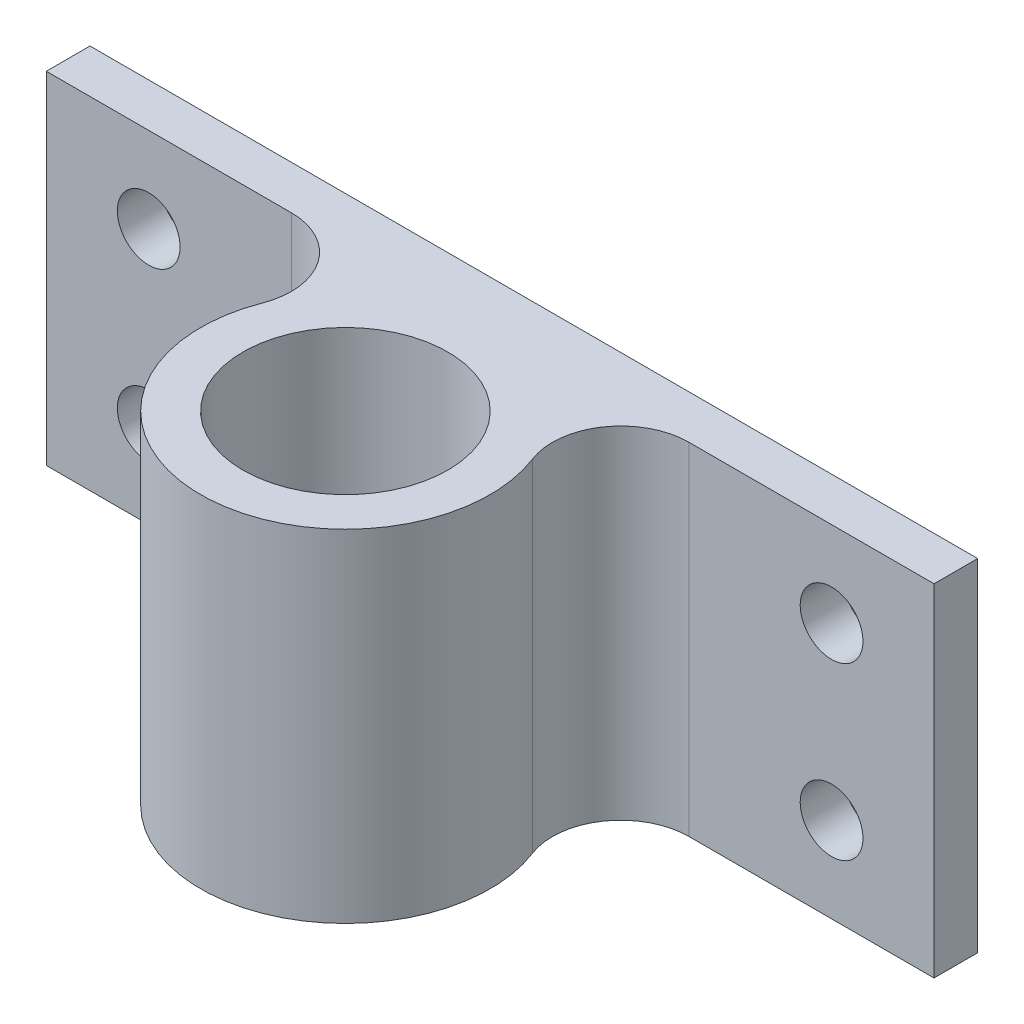
ISO-10303-21;
HEADER;
FILE_DESCRIPTION(('STEP AP214'),'2;1');
FILE_NAME('part.step','',(''),(''),'','','');
FILE_SCHEMA(('AUTOMOTIVE_DESIGN { 1 0 10303 214 1 1 1 1 }'));
ENDSEC;
DATA;
#1=APPLICATION_CONTEXT('core data for automotive mechanical design processes');
#2=APPLICATION_PROTOCOL_DEFINITION('international standard','automotive_design',2000,#1);
#3=PRODUCT_CONTEXT('',#1,'mechanical');
#4=PRODUCT('Part','Part','',(#3));
#5=PRODUCT_RELATED_PRODUCT_CATEGORY('part','',(#4));
#6=PRODUCT_DEFINITION_FORMATION('','',#4);
#7=PRODUCT_DEFINITION_CONTEXT('part definition',#1,'design');
#8=PRODUCT_DEFINITION('design','',#6,#7);
#9=PRODUCT_DEFINITION_SHAPE('','',#8);
#10=(LENGTH_UNIT() NAMED_UNIT(*) SI_UNIT(.MILLI.,.METRE.));
#11=(NAMED_UNIT(*) PLANE_ANGLE_UNIT() SI_UNIT($,.RADIAN.));
#12=(NAMED_UNIT(*) SI_UNIT($,.STERADIAN.) SOLID_ANGLE_UNIT());
#13=UNCERTAINTY_MEASURE_WITH_UNIT(LENGTH_MEASURE(1.E-05),#10,'distance_accuracy_value','');
#14=(GEOMETRIC_REPRESENTATION_CONTEXT(3) GLOBAL_UNCERTAINTY_ASSIGNED_CONTEXT((#13)) GLOBAL_UNIT_ASSIGNED_CONTEXT((#10,
#11,#12)) REPRESENTATION_CONTEXT('',''));
#15=CARTESIAN_POINT('',(0.,0.,0.));
#16=DIRECTION('',(0.,0.,1.));
#17=DIRECTION('',(1.,0.,0.));
#18=AXIS2_PLACEMENT_3D('',#15,#16,#17);
#19=CARTESIAN_POINT('',(145.60219778561,250.,-56.));
#20=DIRECTION('',(0.,-1.,0.));
#21=DIRECTION('',(0.,0.,-1.));
#22=AXIS2_PLACEMENT_3D('',#19,#20,#21);
#23=CYLINDRICAL_SURFACE('',#22,50.);
#24=CARTESIAN_POINT('',(145.60219778561,0.,-56.));
#25=DIRECTION('',(0.,1.,0.));
#26=DIRECTION('',(0.,0.,1.));
#27=AXIS2_PLACEMENT_3D('',#24,#25,#26);
#28=CIRCLE('',#27,50.);
#29=CARTESIAN_POINT('',(98.9348267004788,0.,-38.0512820512821));
#30=VERTEX_POINT('',#29);
#31=CARTESIAN_POINT('',(145.60219778561,0.,-106.));
#32=VERTEX_POINT('',#31);
#33=EDGE_CURVE('E134',#30,#32,#28,.F.);
#34=ORIENTED_EDGE('',*,*,#33,.T.);
#35=DIRECTION('',(0.,-1.,0.));
#36=VECTOR('',#35,1.);
#37=CARTESIAN_POINT('',(145.60219778561,250.,-106.));
#38=LINE('',#37,#36);
#39=CARTESIAN_POINT('',(145.60219778561,250.,-106.));
#40=VERTEX_POINT('',#39);
#41=EDGE_CURVE('E11',#40,#32,#38,.T.);
#42=ORIENTED_EDGE('',*,*,#41,.F.);
#43=CARTESIAN_POINT('',(145.60219778561,250.,-56.));
#44=DIRECTION('',(0.,1.,0.));
#45=DIRECTION('',(0.,0.,1.));
#46=AXIS2_PLACEMENT_3D('',#43,#44,#45);
#47=CIRCLE('',#46,50.);
#48=CARTESIAN_POINT('',(98.9348267004788,250.,-38.0512820512821));
#49=VERTEX_POINT('',#48);
#50=EDGE_CURVE('E156',#49,#40,#47,.F.);
#51=ORIENTED_EDGE('',*,*,#50,.F.);
#52=DIRECTION('',(0.,-1.,0.));
#53=VECTOR('',#52,1.);
#54=CARTESIAN_POINT('',(98.9348267004788,250.,-38.0512820512821));
#55=LINE('',#54,#53);
#56=EDGE_CURVE('E133',#49,#30,#55,.T.);
#57=ORIENTED_EDGE('',*,*,#56,.T.);
#58=EDGE_LOOP('',(#34,#42,#51,#57));
#59=FACE_BOUND('',#58,.T.);
#60=ADVANCED_FACE('F33',(#59),#23,.F.);
#61=CARTESIAN_POINT('',(0.,250.,-106.));
#62=DIRECTION('',(0.,0.,-1.));
#63=DIRECTION('',(-1.,0.,0.));
#64=AXIS2_PLACEMENT_3D('',#61,#62,#63);
#65=PLANE('',#64);
#66=CARTESIAN_POINT('',(250.,62.5,-106.));
#67=DIRECTION('',(0.,0.,-1.));
#68=DIRECTION('',(-1.,0.,0.));
#69=AXIS2_PLACEMENT_3D('',#66,#67,#68);
#70=CIRCLE('',#69,22.984114262253);
#71=CARTESIAN_POINT('',(227.015885737747,62.5,-106.));
#72=VERTEX_POINT('',#71);
#73=EDGE_CURVE('E138',#72,#72,#70,.T.);
#74=ORIENTED_EDGE('',*,*,#73,.T.);
#75=EDGE_LOOP('',(#74));
#76=FACE_BOUND('',#75,.T.);
#77=CARTESIAN_POINT('',(250.,187.5,-106.));
#78=DIRECTION('',(0.,0.,-1.));
#79=DIRECTION('',(-1.,0.,0.));
#80=AXIS2_PLACEMENT_3D('',#77,#78,#79);
#81=CIRCLE('',#80,22.984114262253);
#82=CARTESIAN_POINT('',(227.015885737747,187.5,-106.));
#83=VERTEX_POINT('',#82);
#84=EDGE_CURVE('E171',#83,#83,#81,.T.);
#85=ORIENTED_EDGE('',*,*,#84,.T.);
#86=EDGE_LOOP('',(#85));
#87=FACE_BOUND('',#86,.T.);
#88=DIRECTION('',(1.,0.,0.));
#89=VECTOR('',#88,1.);
#90=CARTESIAN_POINT('',(0.,0.,-106.));
#91=LINE('',#90,#89);
#92=CARTESIAN_POINT('',(325.,0.,-106.));
#93=VERTEX_POINT('',#92);
#94=EDGE_CURVE('E137',#32,#93,#91,.T.);
#95=ORIENTED_EDGE('',*,*,#94,.T.);
#96=DIRECTION('',(0.,-1.,0.));
#97=VECTOR('',#96,1.);
#98=CARTESIAN_POINT('',(325.,250.,-106.));
#99=LINE('',#98,#97);
#100=CARTESIAN_POINT('',(325.,250.,-106.));
#101=VERTEX_POINT('',#100);
#102=EDGE_CURVE('E42',#101,#93,#99,.T.);
#103=ORIENTED_EDGE('',*,*,#102,.F.);
#104=DIRECTION('',(1.,0.,0.));
#105=VECTOR('',#104,1.);
#106=CARTESIAN_POINT('',(0.,250.,-106.));
#107=LINE('',#106,#105);
#108=EDGE_CURVE('E90',#40,#101,#107,.T.);
#109=ORIENTED_EDGE('',*,*,#108,.F.);
#110=ORIENTED_EDGE('',*,*,#41,.T.);
#111=EDGE_LOOP('',(#95,#103,#109,#110));
#112=FACE_BOUND('',#111,.T.);
#113=ADVANCED_FACE('F218',(#76,#87,#112),#65,.F.);
#114=CARTESIAN_POINT('',(325.,250.,0.));
#115=DIRECTION('',(-1.,0.,0.));
#116=DIRECTION('',(0.,0.,1.));
#117=AXIS2_PLACEMENT_3D('',#114,#115,#116);
#118=PLANE('',#117);
#119=DIRECTION('',(0.,0.,-1.));
#120=VECTOR('',#119,1.);
#121=CARTESIAN_POINT('',(325.,0.,0.));
#122=LINE('',#121,#120);
#123=CARTESIAN_POINT('',(325.,0.,-138.));
#124=VERTEX_POINT('',#123);
#125=EDGE_CURVE('E140',#93,#124,#122,.T.);
#126=ORIENTED_EDGE('',*,*,#125,.T.);
#127=DIRECTION('',(0.,-1.,0.));
#128=VECTOR('',#127,1.);
#129=CARTESIAN_POINT('',(325.,250.,-138.));
#130=LINE('',#129,#128);
#131=CARTESIAN_POINT('',(325.,250.,-138.));
#132=VERTEX_POINT('',#131);
#133=EDGE_CURVE('E162',#132,#124,#130,.T.);
#134=ORIENTED_EDGE('',*,*,#133,.F.);
#135=DIRECTION('',(0.,0.,-1.));
#136=VECTOR('',#135,1.);
#137=CARTESIAN_POINT('',(325.,250.,0.));
#138=LINE('',#137,#136);
#139=EDGE_CURVE('E190',#101,#132,#138,.T.);
#140=ORIENTED_EDGE('',*,*,#139,.F.);
#141=ORIENTED_EDGE('',*,*,#102,.T.);
#142=EDGE_LOOP('',(#126,#134,#140,#141));
#143=FACE_BOUND('',#142,.T.);
#144=ADVANCED_FACE('F222',(#143),#118,.F.);
#145=CARTESIAN_POINT('',(0.,250.,-138.));
#146=DIRECTION('',(0.,0.,-1.));
#147=DIRECTION('',(-1.,0.,0.));
#148=AXIS2_PLACEMENT_3D('',#145,#146,#147);
#149=PLANE('',#148);
#150=CARTESIAN_POINT('',(250.,62.5,-138.));
#151=DIRECTION('',(0.,0.,-1.));
#152=DIRECTION('',(1.,0.,0.));
#153=AXIS2_PLACEMENT_3D('',#150,#151,#152);
#154=CIRCLE('',#153,22.984114262253);
#155=CARTESIAN_POINT('',(272.984114262253,62.5,-138.));
#156=VERTEX_POINT('',#155);
#157=EDGE_CURVE('E182',#156,#156,#154,.T.);
#158=ORIENTED_EDGE('',*,*,#157,.F.);
#159=EDGE_LOOP('',(#158));
#160=FACE_BOUND('',#159,.T.);
#161=CARTESIAN_POINT('',(-250.,62.5,-138.));
#162=DIRECTION('',(0.,0.,-1.));
#163=DIRECTION('',(-1.,0.,0.));
#164=AXIS2_PLACEMENT_3D('',#161,#162,#163);
#165=CIRCLE('',#164,22.9841142622528);
#166=CARTESIAN_POINT('',(-272.984114262253,62.5,-138.));
#167=VERTEX_POINT('',#166);
#168=EDGE_CURVE('E178',#167,#167,#165,.T.);
#169=ORIENTED_EDGE('',*,*,#168,.F.);
#170=EDGE_LOOP('',(#169));
#171=FACE_BOUND('',#170,.T.);
#172=CARTESIAN_POINT('',(-250.,187.5,-138.));
#173=DIRECTION('',(0.,0.,-1.));
#174=DIRECTION('',(1.,0.,0.));
#175=AXIS2_PLACEMENT_3D('',#172,#173,#174);
#176=CIRCLE('',#175,22.984114262253);
#177=CARTESIAN_POINT('',(-227.015885737747,187.5,-138.));
#178=VERTEX_POINT('',#177);
#179=EDGE_CURVE('E173',#178,#178,#176,.T.);
#180=ORIENTED_EDGE('',*,*,#179,.F.);
#181=EDGE_LOOP('',(#180));
#182=FACE_BOUND('',#181,.T.);
#183=CARTESIAN_POINT('',(250.,187.5,-138.));
#184=DIRECTION('',(0.,0.,-1.));
#185=DIRECTION('',(-1.,0.,0.));
#186=AXIS2_PLACEMENT_3D('',#183,#184,#185);
#187=CIRCLE('',#186,22.984114262253);
#188=CARTESIAN_POINT('',(227.015885737747,187.5,-138.));
#189=VERTEX_POINT('',#188);
#190=EDGE_CURVE('E167',#189,#189,#187,.T.);
#191=ORIENTED_EDGE('',*,*,#190,.F.);
#192=EDGE_LOOP('',(#191));
#193=FACE_BOUND('',#192,.T.);
#194=DIRECTION('',(1.,0.,0.));
#195=VECTOR('',#194,1.);
#196=CARTESIAN_POINT('',(0.,0.,-138.));
#197=LINE('',#196,#195);
#198=CARTESIAN_POINT('',(-325.,0.,-138.));
#199=VERTEX_POINT('',#198);
#200=EDGE_CURVE('E143',#199,#124,#197,.T.);
#201=ORIENTED_EDGE('',*,*,#200,.F.);
#202=DIRECTION('',(0.,-1.,0.));
#203=VECTOR('',#202,1.);
#204=CARTESIAN_POINT('',(-325.,250.,-138.));
#205=LINE('',#204,#203);
#206=CARTESIAN_POINT('',(-325.,250.,-138.));
#207=VERTEX_POINT('',#206);
#208=EDGE_CURVE('E160',#207,#199,#205,.T.);
#209=ORIENTED_EDGE('',*,*,#208,.F.);
#210=DIRECTION('',(1.,0.,0.));
#211=VECTOR('',#210,1.);
#212=CARTESIAN_POINT('',(0.,250.,-138.));
#213=LINE('',#212,#211);
#214=EDGE_CURVE('E192',#207,#132,#213,.T.);
#215=ORIENTED_EDGE('',*,*,#214,.T.);
#216=ORIENTED_EDGE('',*,*,#133,.T.);
#217=EDGE_LOOP('',(#201,#209,#215,#216));
#218=FACE_BOUND('',#217,.T.);
#219=ADVANCED_FACE('F227',(#160,#171,#182,#193,#218),#149,.T.);
#220=CARTESIAN_POINT('',(-325.,250.,0.));
#221=DIRECTION('',(-1.,0.,0.));
#222=DIRECTION('',(0.,0.,1.));
#223=AXIS2_PLACEMENT_3D('',#220,#221,#222);
#224=PLANE('',#223);
#225=DIRECTION('',(0.,0.,-1.));
#226=VECTOR('',#225,1.);
#227=CARTESIAN_POINT('',(-325.,0.,0.));
#228=LINE('',#227,#226);
#229=CARTESIAN_POINT('',(-325.,0.,-106.));
#230=VERTEX_POINT('',#229);
#231=EDGE_CURVE('E146',#230,#199,#228,.T.);
#232=ORIENTED_EDGE('',*,*,#231,.F.);
#233=DIRECTION('',(0.,-1.,0.));
#234=VECTOR('',#233,1.);
#235=CARTESIAN_POINT('',(-325.,250.,-106.));
#236=LINE('',#235,#234);
#237=CARTESIAN_POINT('',(-325.,250.,-106.));
#238=VERTEX_POINT('',#237);
#239=EDGE_CURVE('E123',#238,#230,#236,.T.);
#240=ORIENTED_EDGE('',*,*,#239,.F.);
#241=DIRECTION('',(0.,0.,-1.));
#242=VECTOR('',#241,1.);
#243=CARTESIAN_POINT('',(-325.,250.,0.));
#244=LINE('',#243,#242);
#245=EDGE_CURVE('E112',#238,#207,#244,.T.);
#246=ORIENTED_EDGE('',*,*,#245,.T.);
#247=ORIENTED_EDGE('',*,*,#208,.T.);
#248=EDGE_LOOP('',(#232,#240,#246,#247));
#249=FACE_BOUND('',#248,.T.);
#250=ADVANCED_FACE('F196',(#249),#224,.T.);
#251=CARTESIAN_POINT('',(0.,250.,-106.));
#252=DIRECTION('',(0.,0.,-1.));
#253=DIRECTION('',(-1.,0.,0.));
#254=AXIS2_PLACEMENT_3D('',#251,#252,#253);
#255=PLANE('',#254);
#256=CARTESIAN_POINT('',(-250.,62.5,-106.));
#257=DIRECTION('',(0.,0.,-1.));
#258=DIRECTION('',(-1.,0.,0.));
#259=AXIS2_PLACEMENT_3D('',#256,#257,#258);
#260=CIRCLE('',#259,22.9841142622528);
#261=CARTESIAN_POINT('',(-272.984114262253,62.5,-106.));
#262=VERTEX_POINT('',#261);
#263=EDGE_CURVE('E36',#262,#262,#260,.T.);
#264=ORIENTED_EDGE('',*,*,#263,.T.);
#265=EDGE_LOOP('',(#264));
#266=FACE_BOUND('',#265,.T.);
#267=CARTESIAN_POINT('',(-250.,187.5,-106.));
#268=DIRECTION('',(0.,0.,-1.));
#269=DIRECTION('',(-1.,0.,0.));
#270=AXIS2_PLACEMENT_3D('',#267,#268,#269);
#271=CIRCLE('',#270,22.984114262253);
#272=CARTESIAN_POINT('',(-272.984114262253,187.5,-106.));
#273=VERTEX_POINT('',#272);
#274=EDGE_CURVE('E165',#273,#273,#271,.T.);
#275=ORIENTED_EDGE('',*,*,#274,.T.);
#276=EDGE_LOOP('',(#275));
#277=FACE_BOUND('',#276,.T.);
#278=DIRECTION('',(1.,0.,0.));
#279=VECTOR('',#278,1.);
#280=CARTESIAN_POINT('',(0.,0.,-106.));
#281=LINE('',#280,#279);
#282=CARTESIAN_POINT('',(-145.60219778561,0.,-106.));
#283=VERTEX_POINT('',#282);
#284=EDGE_CURVE('E119',#230,#283,#281,.T.);
#285=ORIENTED_EDGE('',*,*,#284,.T.);
#286=DIRECTION('',(0.,-1.,0.));
#287=VECTOR('',#286,1.);
#288=CARTESIAN_POINT('',(-145.60219778561,250.,-106.));
#289=LINE('',#288,#287);
#290=CARTESIAN_POINT('',(-145.60219778561,250.,-106.));
#291=VERTEX_POINT('',#290);
#292=EDGE_CURVE('E116',#291,#283,#289,.T.);
#293=ORIENTED_EDGE('',*,*,#292,.F.);
#294=DIRECTION('',(1.,0.,0.));
#295=VECTOR('',#294,1.);
#296=CARTESIAN_POINT('',(0.,250.,-106.));
#297=LINE('',#296,#295);
#298=EDGE_CURVE('E104',#238,#291,#297,.T.);
#299=ORIENTED_EDGE('',*,*,#298,.F.);
#300=ORIENTED_EDGE('',*,*,#239,.T.);
#301=EDGE_LOOP('',(#285,#293,#299,#300));
#302=FACE_BOUND('',#301,.T.);
#303=ADVANCED_FACE('F117',(#266,#277,#302),#255,.F.);
#304=CARTESIAN_POINT('',(-145.60219778561,250.,-56.));
#305=DIRECTION('',(0.,-1.,0.));
#306=DIRECTION('',(0.,0.,-1.));
#307=AXIS2_PLACEMENT_3D('',#304,#305,#306);
#308=CYLINDRICAL_SURFACE('',#307,50.);
#309=CARTESIAN_POINT('',(-145.60219778561,0.,-56.));
#310=DIRECTION('',(0.,1.,0.));
#311=DIRECTION('',(0.,0.,1.));
#312=AXIS2_PLACEMENT_3D('',#309,#310,#311);
#313=CIRCLE('',#312,50.);
#314=CARTESIAN_POINT('',(-98.9348267004789,0.,-38.0512820512821));
#315=VERTEX_POINT('',#314);
#316=EDGE_CURVE('E150',#315,#283,#313,.T.);
#317=ORIENTED_EDGE('',*,*,#316,.F.);
#318=DIRECTION('',(0.,-1.,0.));
#319=VECTOR('',#318,1.);
#320=CARTESIAN_POINT('',(-98.9348267004789,250.,-38.0512820512821));
#321=LINE('',#320,#319);
#322=CARTESIAN_POINT('',(-98.9348267004789,250.,-38.0512820512821));
#323=VERTEX_POINT('',#322);
#324=EDGE_CURVE('E79',#323,#315,#321,.T.);
#325=ORIENTED_EDGE('',*,*,#324,.F.);
#326=CARTESIAN_POINT('',(-145.60219778561,250.,-56.));
#327=DIRECTION('',(0.,1.,0.));
#328=DIRECTION('',(0.,0.,1.));
#329=AXIS2_PLACEMENT_3D('',#326,#327,#328);
#330=CIRCLE('',#329,50.);
#331=EDGE_CURVE('E109',#323,#291,#330,.T.);
#332=ORIENTED_EDGE('',*,*,#331,.T.);
#333=ORIENTED_EDGE('',*,*,#292,.T.);
#334=EDGE_LOOP('',(#317,#325,#332,#333));
#335=FACE_BOUND('',#334,.T.);
#336=ADVANCED_FACE('F125',(#335),#308,.F.);
#337=CARTESIAN_POINT('',(0.,250.,0.));
#338=DIRECTION('',(0.,-1.,0.));
#339=DIRECTION('',(0.,0.,-1.));
#340=AXIS2_PLACEMENT_3D('',#337,#338,#339);
#341=CYLINDRICAL_SURFACE('',#340,106.);
#342=CARTESIAN_POINT('',(0.,0.,0.));
#343=DIRECTION('',(0.,1.,0.));
#344=DIRECTION('',(0.,0.,1.));
#345=AXIS2_PLACEMENT_3D('',#342,#343,#344);
#346=CIRCLE('',#345,106.);
#347=EDGE_CURVE('E82',#315,#30,#346,.T.);
#348=ORIENTED_EDGE('',*,*,#347,.T.);
#349=ORIENTED_EDGE('',*,*,#56,.F.);
#350=CARTESIAN_POINT('',(0.,250.,0.));
#351=DIRECTION('',(0.,1.,0.));
#352=DIRECTION('',(0.,0.,1.));
#353=AXIS2_PLACEMENT_3D('',#350,#351,#352);
#354=CIRCLE('',#353,106.);
#355=EDGE_CURVE('E51',#323,#49,#354,.T.);
#356=ORIENTED_EDGE('',*,*,#355,.F.);
#357=ORIENTED_EDGE('',*,*,#324,.T.);
#358=EDGE_LOOP('',(#348,#349,#356,#357));
#359=FACE_BOUND('',#358,.T.);
#360=ADVANCED_FACE('F206',(#359),#341,.T.);
#361=CARTESIAN_POINT('',(0.,250.,0.));
#362=DIRECTION('',(0.,-1.,0.));
#363=DIRECTION('',(0.,0.,-1.));
#364=AXIS2_PLACEMENT_3D('',#361,#362,#363);
#365=CYLINDRICAL_SURFACE('',#364,75.);
#366=CARTESIAN_POINT('',(0.,250.,0.));
#367=DIRECTION('',(0.,1.,0.));
#368=DIRECTION('',(0.,0.,1.));
#369=AXIS2_PLACEMENT_3D('',#366,#367,#368);
#370=CIRCLE('',#369,75.);
#371=CARTESIAN_POINT('',(0.,250.,75.));
#372=VERTEX_POINT('',#371);
#373=EDGE_CURVE('E127',#372,#372,#370,.T.);
#374=ORIENTED_EDGE('',*,*,#373,.T.);
#375=EDGE_LOOP('',(#374));
#376=FACE_BOUND('',#375,.T.);
#377=CARTESIAN_POINT('',(0.,0.,0.));
#378=DIRECTION('',(0.,1.,0.));
#379=DIRECTION('',(0.,0.,1.));
#380=AXIS2_PLACEMENT_3D('',#377,#378,#379);
#381=CIRCLE('',#380,75.);
#382=CARTESIAN_POINT('',(0.,0.,75.));
#383=VERTEX_POINT('',#382);
#384=EDGE_CURVE('E153',#383,#383,#381,.T.);
#385=ORIENTED_EDGE('',*,*,#384,.F.);
#386=EDGE_LOOP('',(#385));
#387=FACE_BOUND('',#386,.T.);
#388=ADVANCED_FACE('F208',(#376,#387),#365,.F.);
#389=CARTESIAN_POINT('',(0.,250.,0.));
#390=DIRECTION('',(0.,1.,0.));
#391=DIRECTION('',(0.,0.,1.));
#392=AXIS2_PLACEMENT_3D('',#389,#390,#391);
#393=PLANE('',#392);
#394=ORIENTED_EDGE('',*,*,#50,.T.);
#395=ORIENTED_EDGE('',*,*,#108,.T.);
#396=ORIENTED_EDGE('',*,*,#139,.T.);
#397=ORIENTED_EDGE('',*,*,#214,.F.);
#398=ORIENTED_EDGE('',*,*,#245,.F.);
#399=ORIENTED_EDGE('',*,*,#298,.T.);
#400=ORIENTED_EDGE('',*,*,#331,.F.);
#401=ORIENTED_EDGE('',*,*,#355,.T.);
#402=EDGE_LOOP('',(#394,#395,#396,#397,#398,#399,#400,#401));
#403=FACE_BOUND('',#402,.T.);
#404=ORIENTED_EDGE('',*,*,#373,.F.);
#405=EDGE_LOOP('',(#404));
#406=FACE_BOUND('',#405,.T.);
#407=ADVANCED_FACE('F106',(#403,#406),#393,.T.);
#408=CARTESIAN_POINT('',(0.,0.,0.));
#409=DIRECTION('',(0.,1.,0.));
#410=DIRECTION('',(0.,0.,1.));
#411=AXIS2_PLACEMENT_3D('',#408,#409,#410);
#412=PLANE('',#411);
#413=ORIENTED_EDGE('',*,*,#33,.F.);
#414=ORIENTED_EDGE('',*,*,#347,.F.);
#415=ORIENTED_EDGE('',*,*,#316,.T.);
#416=ORIENTED_EDGE('',*,*,#284,.F.);
#417=ORIENTED_EDGE('',*,*,#231,.T.);
#418=ORIENTED_EDGE('',*,*,#200,.T.);
#419=ORIENTED_EDGE('',*,*,#125,.F.);
#420=ORIENTED_EDGE('',*,*,#94,.F.);
#421=EDGE_LOOP('',(#413,#414,#415,#416,#417,#418,#419,#420));
#422=FACE_BOUND('',#421,.T.);
#423=ORIENTED_EDGE('',*,*,#384,.T.);
#424=EDGE_LOOP('',(#423));
#425=FACE_BOUND('',#424,.T.);
#426=ADVANCED_FACE('F200',(#422,#425),#412,.F.);
#427=CARTESIAN_POINT('',(-250.,187.5,106.));
#428=DIRECTION('',(0.,0.,-1.));
#429=DIRECTION('',(-1.,0.,0.));
#430=AXIS2_PLACEMENT_3D('',#427,#428,#429);
#431=CYLINDRICAL_SURFACE('',#430,22.984114262253);
#432=ORIENTED_EDGE('',*,*,#179,.T.);
#433=EDGE_LOOP('',(#432));
#434=FACE_BOUND('',#433,.T.);
#435=ORIENTED_EDGE('',*,*,#274,.F.);
#436=EDGE_LOOP('',(#435));
#437=FACE_BOUND('',#436,.T.);
#438=ADVANCED_FACE('F246',(#434,#437),#431,.F.);
#439=CARTESIAN_POINT('',(-250.,62.5,106.));
#440=DIRECTION('',(0.,0.,-1.));
#441=DIRECTION('',(-1.,0.,0.));
#442=AXIS2_PLACEMENT_3D('',#439,#440,#441);
#443=CYLINDRICAL_SURFACE('',#442,22.9841142622528);
#444=ORIENTED_EDGE('',*,*,#168,.T.);
#445=EDGE_LOOP('',(#444));
#446=FACE_BOUND('',#445,.T.);
#447=ORIENTED_EDGE('',*,*,#263,.F.);
#448=EDGE_LOOP('',(#447));
#449=FACE_BOUND('',#448,.T.);
#450=ADVANCED_FACE('F243',(#446,#449),#443,.F.);
#451=CARTESIAN_POINT('',(250.,187.5,106.));
#452=DIRECTION('',(0.,0.,-1.));
#453=DIRECTION('',(-1.,0.,0.));
#454=AXIS2_PLACEMENT_3D('',#451,#452,#453);
#455=CYLINDRICAL_SURFACE('',#454,22.984114262253);
#456=ORIENTED_EDGE('',*,*,#190,.T.);
#457=EDGE_LOOP('',(#456));
#458=FACE_BOUND('',#457,.T.);
#459=ORIENTED_EDGE('',*,*,#84,.F.);
#460=EDGE_LOOP('',(#459));
#461=FACE_BOUND('',#460,.T.);
#462=ADVANCED_FACE('F245',(#458,#461),#455,.F.);
#463=CARTESIAN_POINT('',(250.,62.5,106.));
#464=DIRECTION('',(0.,0.,-1.));
#465=DIRECTION('',(-1.,0.,0.));
#466=AXIS2_PLACEMENT_3D('',#463,#464,#465);
#467=CYLINDRICAL_SURFACE('',#466,22.984114262253);
#468=ORIENTED_EDGE('',*,*,#157,.T.);
#469=EDGE_LOOP('',(#468));
#470=FACE_BOUND('',#469,.T.);
#471=ORIENTED_EDGE('',*,*,#73,.F.);
#472=EDGE_LOOP('',(#471));
#473=FACE_BOUND('',#472,.T.);
#474=ADVANCED_FACE('F253',(#470,#473),#467,.F.);
#475=CLOSED_SHELL('',(#60,#113,#144,#219,#250,#303,#336,#360,#388,#407,#426,#438,#450,#462,#474));
#476=MANIFOLD_SOLID_BREP('B2',#475);
#477=ADVANCED_BREP_SHAPE_REPRESENTATION('',(#18,#476),#14);
#478=SHAPE_DEFINITION_REPRESENTATION(#9,#477);
ENDSEC;
END-ISO-10303-21;
